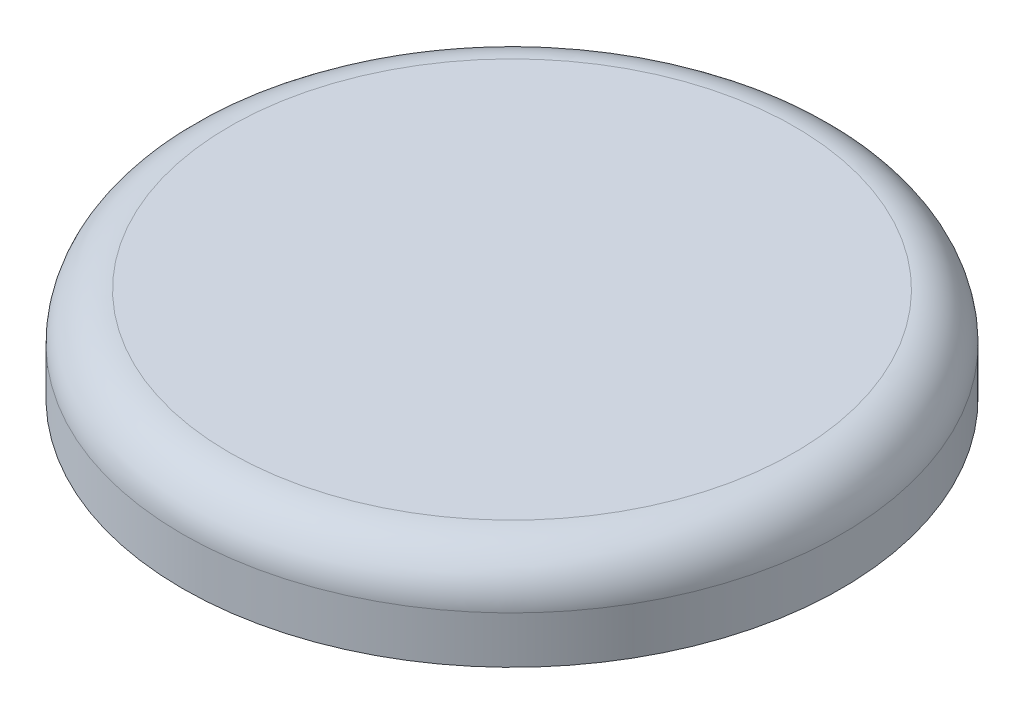
ISO-10303-21;
HEADER;
FILE_DESCRIPTION(('STEP AP214'),'2;1');
FILE_NAME('part.step','',(''),(''),'','','');
FILE_SCHEMA(('AUTOMOTIVE_DESIGN { 1 0 10303 214 1 1 1 1 }'));
ENDSEC;
DATA;
#1=APPLICATION_CONTEXT('core data for automotive mechanical design processes');
#2=APPLICATION_PROTOCOL_DEFINITION('international standard','automotive_design',2000,#1);
#3=PRODUCT_CONTEXT('',#1,'mechanical');
#4=PRODUCT('Part','Part','',(#3));
#5=PRODUCT_RELATED_PRODUCT_CATEGORY('part','',(#4));
#6=PRODUCT_DEFINITION_FORMATION('','',#4);
#7=PRODUCT_DEFINITION_CONTEXT('part definition',#1,'design');
#8=PRODUCT_DEFINITION('design','',#6,#7);
#9=PRODUCT_DEFINITION_SHAPE('','',#8);
#10=(LENGTH_UNIT() NAMED_UNIT(*) SI_UNIT(.MILLI.,.METRE.));
#11=(NAMED_UNIT(*) PLANE_ANGLE_UNIT() SI_UNIT($,.RADIAN.));
#12=(NAMED_UNIT(*) SI_UNIT($,.STERADIAN.) SOLID_ANGLE_UNIT());
#13=UNCERTAINTY_MEASURE_WITH_UNIT(LENGTH_MEASURE(1.E-05),#10,'distance_accuracy_value','');
#14=(GEOMETRIC_REPRESENTATION_CONTEXT(3) GLOBAL_UNCERTAINTY_ASSIGNED_CONTEXT((#13)) GLOBAL_UNIT_ASSIGNED_CONTEXT((#10,
#11,#12)) REPRESENTATION_CONTEXT('',''));
#15=CARTESIAN_POINT('',(0.,0.,0.));
#16=DIRECTION('',(0.,0.,1.));
#17=DIRECTION('',(1.,0.,0.));
#18=AXIS2_PLACEMENT_3D('',#15,#16,#17);
#19=CARTESIAN_POINT('',(0.,10.,0.));
#20=DIRECTION('',(0.,-1.,0.));
#21=DIRECTION('',(0.,0.,-1.));
#22=AXIS2_PLACEMENT_3D('',#19,#20,#21);
#23=CYLINDRICAL_SURFACE('',#22,35.);
#24=CARTESIAN_POINT('',(0.,5.,0.));
#25=DIRECTION('',(0.,1.,0.));
#26=DIRECTION('',(0.,0.,1.));
#27=AXIS2_PLACEMENT_3D('',#24,#25,#26);
#28=CIRCLE('',#27,35.);
#29=CARTESIAN_POINT('',(0.,5.,35.));
#30=VERTEX_POINT('',#29);
#31=EDGE_CURVE('E10',#30,#30,#28,.F.);
#32=ORIENTED_EDGE('',*,*,#31,.T.);
#33=EDGE_LOOP('',(#32));
#34=FACE_BOUND('',#33,.T.);
#35=CARTESIAN_POINT('',(0.,0.,0.));
#36=DIRECTION('',(0.,1.,0.));
#37=DIRECTION('',(0.,0.,1.));
#38=AXIS2_PLACEMENT_3D('',#35,#36,#37);
#39=CIRCLE('',#38,35.);
#40=CARTESIAN_POINT('',(0.,0.,35.));
#41=VERTEX_POINT('',#40);
#42=EDGE_CURVE('E49',#41,#41,#39,.T.);
#43=ORIENTED_EDGE('',*,*,#42,.T.);
#44=EDGE_LOOP('',(#43));
#45=FACE_BOUND('',#44,.T.);
#46=ADVANCED_FACE('F39',(#34,#45),#23,.T.);
#47=CARTESIAN_POINT('',(0.,10.,0.));
#48=DIRECTION('',(0.,1.,0.));
#49=DIRECTION('',(0.,0.,1.));
#50=AXIS2_PLACEMENT_3D('',#47,#48,#49);
#51=PLANE('',#50);
#52=CARTESIAN_POINT('',(0.,10.,0.));
#53=DIRECTION('',(0.,1.,0.));
#54=DIRECTION('',(0.,0.,1.));
#55=AXIS2_PLACEMENT_3D('',#52,#53,#54);
#56=CIRCLE('',#55,30.);
#57=CARTESIAN_POINT('',(0.,10.,30.));
#58=VERTEX_POINT('',#57);
#59=EDGE_CURVE('E46',#58,#58,#56,.T.);
#60=ORIENTED_EDGE('',*,*,#59,.T.);
#61=EDGE_LOOP('',(#60));
#62=FACE_BOUND('',#61,.T.);
#63=ADVANCED_FACE('F74',(#62),#51,.T.);
#64=CARTESIAN_POINT('',(0.,0.,0.));
#65=DIRECTION('',(0.,1.,0.));
#66=DIRECTION('',(0.,0.,1.));
#67=AXIS2_PLACEMENT_3D('',#64,#65,#66);
#68=PLANE('',#67);
#69=CARTESIAN_POINT('',(0.,0.,0.));
#70=DIRECTION('',(0.,-1.,0.));
#71=DIRECTION('',(0.,0.,-1.));
#72=AXIS2_PLACEMENT_3D('',#69,#70,#71);
#73=CIRCLE('',#72,10.);
#74=CARTESIAN_POINT('',(0.,0.,-10.));
#75=VERTEX_POINT('',#74);
#76=EDGE_CURVE('E60',#75,#75,#73,.T.);
#77=ORIENTED_EDGE('',*,*,#76,.F.);
#78=EDGE_LOOP('',(#77));
#79=FACE_BOUND('',#78,.T.);
#80=ORIENTED_EDGE('',*,*,#42,.F.);
#81=EDGE_LOOP('',(#80));
#82=FACE_BOUND('',#81,.T.);
#83=ADVANCED_FACE('F72',(#79,#82),#68,.F.);
#84=CARTESIAN_POINT('',(0.,5.,0.));
#85=DIRECTION('',(0.,1.,0.));
#86=DIRECTION('',(0.,0.,1.));
#87=AXIS2_PLACEMENT_3D('',#84,#85,#86);
#88=TOROIDAL_SURFACE('',#87,30.,5.);
#89=ORIENTED_EDGE('',*,*,#31,.F.);
#90=EDGE_LOOP('',(#89));
#91=FACE_BOUND('',#90,.T.);
#92=ORIENTED_EDGE('',*,*,#59,.F.);
#93=EDGE_LOOP('',(#92));
#94=FACE_BOUND('',#93,.T.);
#95=ADVANCED_FACE('F41',(#91,#94),#88,.T.);
#96=CARTESIAN_POINT('',(0.,5.,0.));
#97=DIRECTION('',(0.,-1.,0.));
#98=DIRECTION('',(0.,0.,-1.));
#99=AXIS2_PLACEMENT_3D('',#96,#97,#98);
#100=CYLINDRICAL_SURFACE('',#99,10.);
#101=CARTESIAN_POINT('',(0.,5.,0.));
#102=DIRECTION('',(0.,-1.,0.));
#103=DIRECTION('',(0.,0.,-1.));
#104=AXIS2_PLACEMENT_3D('',#101,#102,#103);
#105=CIRCLE('',#104,10.);
#106=CARTESIAN_POINT('',(0.,5.,-10.));
#107=VERTEX_POINT('',#106);
#108=EDGE_CURVE('E53',#107,#107,#105,.T.);
#109=ORIENTED_EDGE('',*,*,#108,.F.);
#110=EDGE_LOOP('',(#109));
#111=FACE_BOUND('',#110,.T.);
#112=ORIENTED_EDGE('',*,*,#76,.T.);
#113=EDGE_LOOP('',(#112));
#114=FACE_BOUND('',#113,.T.);
#115=ADVANCED_FACE('F62',(#111,#114),#100,.F.);
#116=CARTESIAN_POINT('',(0.,5.,0.));
#117=DIRECTION('',(0.,-1.,0.));
#118=DIRECTION('',(0.,0.,-1.));
#119=AXIS2_PLACEMENT_3D('',#116,#117,#118);
#120=PLANE('',#119);
#121=ORIENTED_EDGE('',*,*,#108,.T.);
#122=EDGE_LOOP('',(#121));
#123=FACE_BOUND('',#122,.T.);
#124=ADVANCED_FACE('F65',(#123),#120,.T.);
#125=CLOSED_SHELL('',(#46,#63,#83,#95,#115,#124));
#126=MANIFOLD_SOLID_BREP('B2',#125);
#127=ADVANCED_BREP_SHAPE_REPRESENTATION('',(#18,#126),#14);
#128=SHAPE_DEFINITION_REPRESENTATION(#9,#127);
ENDSEC;
END-ISO-10303-21;
